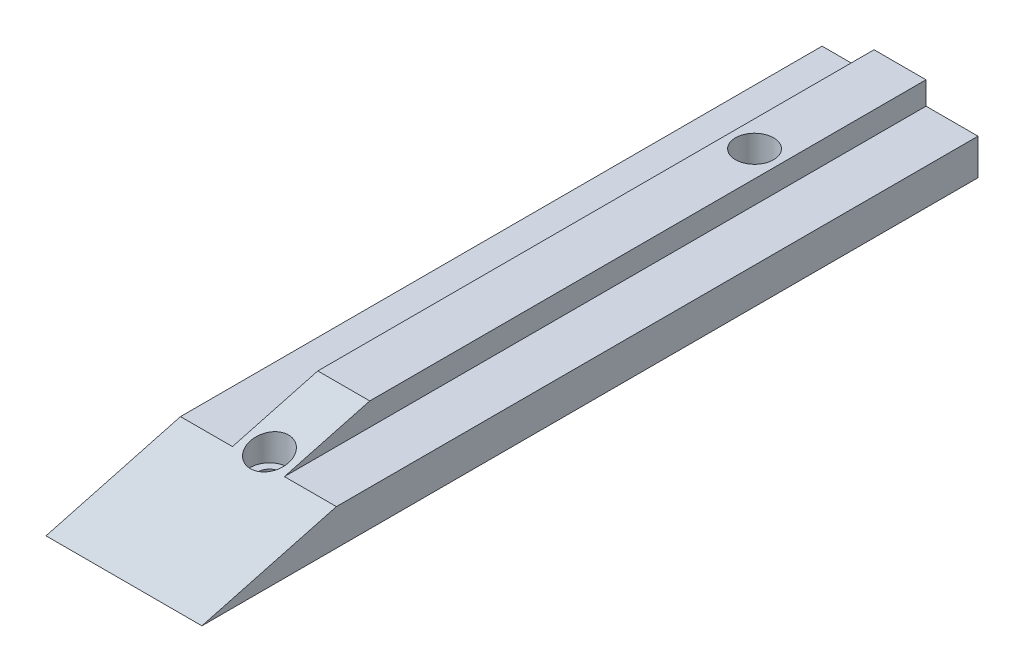
ISO-10303-21;
HEADER;
FILE_DESCRIPTION(('STEP AP214'),'2;1');
FILE_NAME('part.step','',(''),(''),'','','');
FILE_SCHEMA(('AUTOMOTIVE_DESIGN { 1 0 10303 214 1 1 1 1 }'));
ENDSEC;
DATA;
#1=APPLICATION_CONTEXT('core data for automotive mechanical design processes');
#2=APPLICATION_PROTOCOL_DEFINITION('international standard','automotive_design',2000,#1);
#3=PRODUCT_CONTEXT('',#1,'mechanical');
#4=PRODUCT('Part','Part','',(#3));
#5=PRODUCT_RELATED_PRODUCT_CATEGORY('part','',(#4));
#6=PRODUCT_DEFINITION_FORMATION('','',#4);
#7=PRODUCT_DEFINITION_CONTEXT('part definition',#1,'design');
#8=PRODUCT_DEFINITION('design','',#6,#7);
#9=PRODUCT_DEFINITION_SHAPE('','',#8);
#10=(LENGTH_UNIT() NAMED_UNIT(*) SI_UNIT(.MILLI.,.METRE.));
#11=(NAMED_UNIT(*) PLANE_ANGLE_UNIT() SI_UNIT($,.RADIAN.));
#12=(NAMED_UNIT(*) SI_UNIT($,.STERADIAN.) SOLID_ANGLE_UNIT());
#13=UNCERTAINTY_MEASURE_WITH_UNIT(LENGTH_MEASURE(1.E-05),#10,'distance_accuracy_value','');
#14=(GEOMETRIC_REPRESENTATION_CONTEXT(3) GLOBAL_UNCERTAINTY_ASSIGNED_CONTEXT((#13)) GLOBAL_UNIT_ASSIGNED_CONTEXT((#10,
#11,#12)) REPRESENTATION_CONTEXT('',''));
#15=CARTESIAN_POINT('',(0.,0.,0.));
#16=DIRECTION('',(0.,0.,1.));
#17=DIRECTION('',(1.,0.,0.));
#18=AXIS2_PLACEMENT_3D('',#15,#16,#17);
#19=CARTESIAN_POINT('',(22.5,10.4,112.));
#20=DIRECTION('',(0.,-1.,0.));
#21=DIRECTION('',(0.,0.,-1.));
#22=AXIS2_PLACEMENT_3D('',#19,#20,#21);
#23=PLANE('',#22);
#24=DIRECTION('',(0.,0.,-1.));
#25=VECTOR('',#24,1.);
#26=CARTESIAN_POINT('',(7.5,10.4,112.));
#27=LINE('',#26,#25);
#28=CARTESIAN_POINT('',(7.5,10.4,73.1866716012838));
#29=VERTEX_POINT('',#28);
#30=CARTESIAN_POINT('',(7.5,10.4,-112.));
#31=VERTEX_POINT('',#30);
#32=EDGE_CURVE('E11',#29,#31,#27,.T.);
#33=ORIENTED_EDGE('',*,*,#32,.F.);
#34=DIRECTION('',(1.,0.,0.));
#35=VECTOR('',#34,1.);
#36=CARTESIAN_POINT('',(22.5,10.4,73.1866716012838));
#37=LINE('',#36,#35);
#38=CARTESIAN_POINT('',(22.5,10.4,73.1866716012837));
#39=VERTEX_POINT('',#38);
#40=EDGE_CURVE('E180',#29,#39,#37,.T.);
#41=ORIENTED_EDGE('',*,*,#40,.T.);
#42=DIRECTION('',(0.,0.,-1.));
#43=VECTOR('',#42,1.);
#44=CARTESIAN_POINT('',(22.5,10.4,112.));
#45=LINE('',#44,#43);
#46=CARTESIAN_POINT('',(22.5,10.4,-112.));
#47=VERTEX_POINT('',#46);
#48=EDGE_CURVE('E115',#39,#47,#45,.T.);
#49=ORIENTED_EDGE('',*,*,#48,.T.);
#50=DIRECTION('',(-1.,0.,0.));
#51=VECTOR('',#50,1.);
#52=CARTESIAN_POINT('',(22.5,10.4,-112.));
#53=LINE('',#52,#51);
#54=EDGE_CURVE('E120',#47,#31,#53,.T.);
#55=ORIENTED_EDGE('',*,*,#54,.T.);
#56=EDGE_LOOP('',(#33,#41,#49,#55));
#57=FACE_BOUND('',#56,.T.);
#58=ADVANCED_FACE('F45',(#57),#23,.F.);
#59=CARTESIAN_POINT('',(7.5,10.4,112.));
#60=DIRECTION('',(-1.,0.,0.));
#61=DIRECTION('',(0.,0.,1.));
#62=AXIS2_PLACEMENT_3D('',#59,#60,#61);
#63=PLANE('',#62);
#64=DIRECTION('',(0.,0.,-1.));
#65=VECTOR('',#64,1.);
#66=CARTESIAN_POINT('',(7.5,17.,112.));
#67=LINE('',#66,#65);
#68=CARTESIAN_POINT('',(7.49999999999999,17.,48.5551362713293));
#69=VERTEX_POINT('',#68);
#70=CARTESIAN_POINT('',(7.5,17.,-112.));
#71=VERTEX_POINT('',#70);
#72=EDGE_CURVE('E55',#69,#71,#67,.T.);
#73=ORIENTED_EDGE('',*,*,#72,.F.);
#74=DIRECTION('',(0.,-0.258819045102522,0.965925826289068));
#75=VECTOR('',#74,1.);
#76=CARTESIAN_POINT('',(7.5,0.696667900320917,109.4));
#77=LINE('',#76,#75);
#78=EDGE_CURVE('E176',#69,#29,#77,.T.);
#79=ORIENTED_EDGE('',*,*,#78,.T.);
#80=ORIENTED_EDGE('',*,*,#32,.T.);
#81=DIRECTION('',(0.,1.,0.));
#82=VECTOR('',#81,1.);
#83=CARTESIAN_POINT('',(7.5,10.4,-112.));
#84=LINE('',#83,#82);
#85=EDGE_CURVE('E185',#31,#71,#84,.T.);
#86=ORIENTED_EDGE('',*,*,#85,.T.);
#87=EDGE_LOOP('',(#73,#79,#80,#86));
#88=FACE_BOUND('',#87,.T.);
#89=ADVANCED_FACE('F233',(#88),#63,.F.);
#90=CARTESIAN_POINT('',(-7.5,17.,112.));
#91=DIRECTION('',(0.,-1.,0.));
#92=DIRECTION('',(0.,0.,-1.));
#93=AXIS2_PLACEMENT_3D('',#90,#91,#92);
#94=PLANE('',#93);
#95=CARTESIAN_POINT('',(0.,17.,-70.));
#96=DIRECTION('',(0.,1.,0.));
#97=DIRECTION('',(0.,0.,1.));
#98=AXIS2_PLACEMENT_3D('',#95,#96,#97);
#99=CIRCLE('',#98,5.5);
#100=CARTESIAN_POINT('',(0.,17.,-64.5));
#101=VERTEX_POINT('',#100);
#102=EDGE_CURVE('E289',#101,#101,#99,.T.);
#103=ORIENTED_EDGE('',*,*,#102,.F.);
#104=EDGE_LOOP('',(#103));
#105=FACE_BOUND('',#104,.T.);
#106=DIRECTION('',(0.,0.,-1.));
#107=VECTOR('',#106,1.);
#108=CARTESIAN_POINT('',(-7.5,17.,112.));
#109=LINE('',#108,#107);
#110=CARTESIAN_POINT('',(-7.5,17.,48.5551362713293));
#111=VERTEX_POINT('',#110);
#112=CARTESIAN_POINT('',(-7.5,17.,-112.));
#113=VERTEX_POINT('',#112);
#114=EDGE_CURVE('E139',#111,#113,#109,.T.);
#115=ORIENTED_EDGE('',*,*,#114,.F.);
#116=DIRECTION('',(1.,0.,0.));
#117=VECTOR('',#116,1.);
#118=CARTESIAN_POINT('',(-22.5,17.,48.5551362713293));
#119=LINE('',#118,#117);
#120=EDGE_CURVE('E161',#111,#69,#119,.T.);
#121=ORIENTED_EDGE('',*,*,#120,.T.);
#122=ORIENTED_EDGE('',*,*,#72,.T.);
#123=DIRECTION('',(-1.,0.,0.));
#124=VECTOR('',#123,1.);
#125=CARTESIAN_POINT('',(-7.5,17.,-112.));
#126=LINE('',#125,#124);
#127=EDGE_CURVE('E189',#71,#113,#126,.T.);
#128=ORIENTED_EDGE('',*,*,#127,.T.);
#129=EDGE_LOOP('',(#115,#121,#122,#128));
#130=FACE_BOUND('',#129,.T.);
#131=ADVANCED_FACE('F219',(#105,#130),#94,.F.);
#132=CARTESIAN_POINT('',(-7.5,10.4,112.));
#133=DIRECTION('',(1.,0.,0.));
#134=DIRECTION('',(0.,0.,-1.));
#135=AXIS2_PLACEMENT_3D('',#132,#133,#134);
#136=PLANE('',#135);
#137=DIRECTION('',(0.,0.,-1.));
#138=VECTOR('',#137,1.);
#139=CARTESIAN_POINT('',(-7.5,10.4,112.));
#140=LINE('',#139,#138);
#141=CARTESIAN_POINT('',(-7.5,10.4,73.1866716012838));
#142=VERTEX_POINT('',#141);
#143=CARTESIAN_POINT('',(-7.5,10.4,-112.));
#144=VERTEX_POINT('',#143);
#145=EDGE_CURVE('E136',#142,#144,#140,.T.);
#146=ORIENTED_EDGE('',*,*,#145,.F.);
#147=DIRECTION('',(0.,0.258819045102522,-0.965925826289068));
#148=VECTOR('',#147,1.);
#149=CARTESIAN_POINT('',(-7.5,0.696667900320917,109.4));
#150=LINE('',#149,#148);
#151=EDGE_CURVE('E172',#142,#111,#150,.T.);
#152=ORIENTED_EDGE('',*,*,#151,.T.);
#153=ORIENTED_EDGE('',*,*,#114,.T.);
#154=DIRECTION('',(0.,-1.,0.));
#155=VECTOR('',#154,1.);
#156=CARTESIAN_POINT('',(-7.5,10.4,-112.));
#157=LINE('',#156,#155);
#158=EDGE_CURVE('E193',#113,#144,#157,.T.);
#159=ORIENTED_EDGE('',*,*,#158,.T.);
#160=EDGE_LOOP('',(#146,#152,#153,#159));
#161=FACE_BOUND('',#160,.T.);
#162=ADVANCED_FACE('F214',(#161),#136,.F.);
#163=CARTESIAN_POINT('',(-22.5,10.4,112.));
#164=DIRECTION('',(0.,-1.,0.));
#165=DIRECTION('',(0.,0.,-1.));
#166=AXIS2_PLACEMENT_3D('',#163,#164,#165);
#167=PLANE('',#166);
#168=DIRECTION('',(0.,0.,-1.));
#169=VECTOR('',#168,1.);
#170=CARTESIAN_POINT('',(-22.5,10.4,112.));
#171=LINE('',#170,#169);
#172=CARTESIAN_POINT('',(-22.5,10.4,73.1866716012837));
#173=VERTEX_POINT('',#172);
#174=CARTESIAN_POINT('',(-22.5,10.4,-112.));
#175=VERTEX_POINT('',#174);
#176=EDGE_CURVE('E133',#173,#175,#171,.T.);
#177=ORIENTED_EDGE('',*,*,#176,.F.);
#178=DIRECTION('',(1.,0.,0.));
#179=VECTOR('',#178,1.);
#180=CARTESIAN_POINT('',(-22.5,10.4,73.1866716012838));
#181=LINE('',#180,#179);
#182=EDGE_CURVE('E168',#173,#142,#181,.T.);
#183=ORIENTED_EDGE('',*,*,#182,.T.);
#184=ORIENTED_EDGE('',*,*,#145,.T.);
#185=DIRECTION('',(-1.,0.,0.));
#186=VECTOR('',#185,1.);
#187=CARTESIAN_POINT('',(-22.5,10.4,-112.));
#188=LINE('',#187,#186);
#189=EDGE_CURVE('E197',#144,#175,#188,.T.);
#190=ORIENTED_EDGE('',*,*,#189,.T.);
#191=EDGE_LOOP('',(#177,#183,#184,#190));
#192=FACE_BOUND('',#191,.T.);
#193=ADVANCED_FACE('F209',(#192),#167,.F.);
#194=CARTESIAN_POINT('',(-22.5,0.,112.));
#195=DIRECTION('',(1.,0.,0.));
#196=DIRECTION('',(0.,0.,-1.));
#197=AXIS2_PLACEMENT_3D('',#194,#195,#196);
#198=PLANE('',#197);
#199=DIRECTION('',(0.,0.,-1.));
#200=VECTOR('',#199,1.);
#201=CARTESIAN_POINT('',(-22.5,0.,112.));
#202=LINE('',#201,#200);
#203=CARTESIAN_POINT('',(-22.5,0.,112.));
#204=VERTEX_POINT('',#203);
#205=CARTESIAN_POINT('',(-22.5,0.,-112.));
#206=VERTEX_POINT('',#205);
#207=EDGE_CURVE('E98',#204,#206,#202,.T.);
#208=ORIENTED_EDGE('',*,*,#207,.F.);
#209=DIRECTION('',(0.,0.258819045102522,-0.965925826289068));
#210=VECTOR('',#209,1.);
#211=CARTESIAN_POINT('',(-22.5,0.,112.));
#212=LINE('',#211,#210);
#213=EDGE_CURVE('E63',#204,#173,#212,.T.);
#214=ORIENTED_EDGE('',*,*,#213,.T.);
#215=ORIENTED_EDGE('',*,*,#176,.T.);
#216=DIRECTION('',(0.,-1.,0.));
#217=VECTOR('',#216,1.);
#218=CARTESIAN_POINT('',(-22.5,0.,-112.));
#219=LINE('',#218,#217);
#220=EDGE_CURVE('E104',#175,#206,#219,.T.);
#221=ORIENTED_EDGE('',*,*,#220,.T.);
#222=EDGE_LOOP('',(#208,#214,#215,#221));
#223=FACE_BOUND('',#222,.T.);
#224=ADVANCED_FACE('F203',(#223),#198,.F.);
#225=CARTESIAN_POINT('',(22.5,0.,112.));
#226=DIRECTION('',(0.,1.,0.));
#227=DIRECTION('',(0.,0.,1.));
#228=AXIS2_PLACEMENT_3D('',#225,#226,#227);
#229=PLANE('',#228);
#230=CARTESIAN_POINT('',(0.,0.,-70.));
#231=DIRECTION('',(0.,1.,0.));
#232=DIRECTION('',(0.,0.,1.));
#233=AXIS2_PLACEMENT_3D('',#230,#231,#232);
#234=CIRCLE('',#233,3.3);
#235=CARTESIAN_POINT('',(0.,0.,-66.7));
#236=VERTEX_POINT('',#235);
#237=EDGE_CURVE('E48',#236,#236,#234,.T.);
#238=ORIENTED_EDGE('',*,*,#237,.T.);
#239=EDGE_LOOP('',(#238));
#240=FACE_BOUND('',#239,.T.);
#241=CARTESIAN_POINT('',(0.,0.,70.));
#242=DIRECTION('',(0.,1.,0.));
#243=DIRECTION('',(0.,0.,1.));
#244=AXIS2_PLACEMENT_3D('',#241,#242,#243);
#245=CIRCLE('',#244,3.3);
#246=CARTESIAN_POINT('',(0.,0.,73.3));
#247=VERTEX_POINT('',#246);
#248=EDGE_CURVE('E147',#247,#247,#245,.T.);
#249=ORIENTED_EDGE('',*,*,#248,.T.);
#250=EDGE_LOOP('',(#249));
#251=FACE_BOUND('',#250,.T.);
#252=DIRECTION('',(1.,0.,0.));
#253=VECTOR('',#252,1.);
#254=CARTESIAN_POINT('',(22.5,0.,-112.));
#255=LINE('',#254,#253);
#256=CARTESIAN_POINT('',(22.5,0.,-112.));
#257=VERTEX_POINT('',#256);
#258=EDGE_CURVE('E92',#206,#257,#255,.T.);
#259=ORIENTED_EDGE('',*,*,#258,.T.);
#260=DIRECTION('',(0.,0.,-1.));
#261=VECTOR('',#260,1.);
#262=CARTESIAN_POINT('',(22.5,0.,112.));
#263=LINE('',#262,#261);
#264=CARTESIAN_POINT('',(22.5,0.,112.));
#265=VERTEX_POINT('',#264);
#266=EDGE_CURVE('E97',#265,#257,#263,.T.);
#267=ORIENTED_EDGE('',*,*,#266,.F.);
#268=DIRECTION('',(1.,0.,0.));
#269=VECTOR('',#268,1.);
#270=CARTESIAN_POINT('',(22.5,0.,112.));
#271=LINE('',#270,#269);
#272=EDGE_CURVE('E122',#204,#265,#271,.T.);
#273=ORIENTED_EDGE('',*,*,#272,.F.);
#274=ORIENTED_EDGE('',*,*,#207,.T.);
#275=EDGE_LOOP('',(#259,#267,#273,#274));
#276=FACE_BOUND('',#275,.T.);
#277=ADVANCED_FACE('F94',(#240,#251,#276),#229,.F.);
#278=CARTESIAN_POINT('',(22.5,0.,112.));
#279=DIRECTION('',(-1.,0.,0.));
#280=DIRECTION('',(0.,0.,1.));
#281=AXIS2_PLACEMENT_3D('',#278,#279,#280);
#282=PLANE('',#281);
#283=ORIENTED_EDGE('',*,*,#48,.F.);
#284=DIRECTION('',(0.,0.258819045102522,-0.965925826289068));
#285=VECTOR('',#284,1.);
#286=CARTESIAN_POINT('',(22.5,0.,112.));
#287=LINE('',#286,#285);
#288=EDGE_CURVE('E113',#265,#39,#287,.T.);
#289=ORIENTED_EDGE('',*,*,#288,.F.);
#290=ORIENTED_EDGE('',*,*,#266,.T.);
#291=DIRECTION('',(0.,1.,0.));
#292=VECTOR('',#291,1.);
#293=CARTESIAN_POINT('',(22.5,0.,-112.));
#294=LINE('',#293,#292);
#295=EDGE_CURVE('E103',#257,#47,#294,.T.);
#296=ORIENTED_EDGE('',*,*,#295,.T.);
#297=EDGE_LOOP('',(#283,#289,#290,#296));
#298=FACE_BOUND('',#297,.T.);
#299=ADVANCED_FACE('F110',(#298),#282,.F.);
#300=CARTESIAN_POINT('',(0.,0.,-112.));
#301=DIRECTION('',(0.,0.,-1.));
#302=DIRECTION('',(-1.,0.,0.));
#303=AXIS2_PLACEMENT_3D('',#300,#301,#302);
#304=PLANE('',#303);
#305=ORIENTED_EDGE('',*,*,#54,.F.);
#306=ORIENTED_EDGE('',*,*,#295,.F.);
#307=ORIENTED_EDGE('',*,*,#258,.F.);
#308=ORIENTED_EDGE('',*,*,#220,.F.);
#309=ORIENTED_EDGE('',*,*,#189,.F.);
#310=ORIENTED_EDGE('',*,*,#158,.F.);
#311=ORIENTED_EDGE('',*,*,#127,.F.);
#312=ORIENTED_EDGE('',*,*,#85,.F.);
#313=EDGE_LOOP('',(#305,#306,#307,#308,#309,#310,#311,#312));
#314=FACE_BOUND('',#313,.T.);
#315=ADVANCED_FACE('F117',(#314),#304,.T.);
#316=CARTESIAN_POINT('',(-22.5,0.,112.));
#317=DIRECTION('',(0.,-0.965925826289068,-0.258819045102522));
#318=DIRECTION('',(0.,0.258819045102522,-0.965925826289068));
#319=AXIS2_PLACEMENT_3D('',#316,#317,#318);
#320=PLANE('',#319);
#321=CARTESIAN_POINT('',(0.,11.2538660821072,70.));
#322=DIRECTION('',(0.,-0.965925826289068,-0.258819045102522));
#323=DIRECTION('',(0.,0.258819045102522,-0.965925826289068));
#324=AXIS2_PLACEMENT_3D('',#321,#322,#323);
#325=ELLIPSE('',#324,5.69401899225546,5.5);
#326=CARTESIAN_POINT('',(0.,12.7275866404784,64.5));
#327=VERTEX_POINT('',#326);
#328=EDGE_CURVE('E144',#327,#327,#325,.T.);
#329=ORIENTED_EDGE('',*,*,#328,.T.);
#330=EDGE_LOOP('',(#329));
#331=FACE_BOUND('',#330,.T.);
#332=ORIENTED_EDGE('',*,*,#78,.F.);
#333=ORIENTED_EDGE('',*,*,#120,.F.);
#334=ORIENTED_EDGE('',*,*,#151,.F.);
#335=ORIENTED_EDGE('',*,*,#182,.F.);
#336=ORIENTED_EDGE('',*,*,#213,.F.);
#337=ORIENTED_EDGE('',*,*,#272,.T.);
#338=ORIENTED_EDGE('',*,*,#288,.T.);
#339=ORIENTED_EDGE('',*,*,#40,.F.);
#340=EDGE_LOOP('',(#332,#333,#334,#335,#336,#337,#338,#339));
#341=FACE_BOUND('',#340,.T.);
#342=ADVANCED_FACE('F232',(#331,#341),#320,.F.);
#343=CARTESIAN_POINT('',(0.,17.,70.));
#344=DIRECTION('',(0.,1.,0.));
#345=DIRECTION('',(0.,0.,1.));
#346=AXIS2_PLACEMENT_3D('',#343,#344,#345);
#347=CYLINDRICAL_SURFACE('',#346,3.3);
#348=CARTESIAN_POINT('',(0.,4.6,70.));
#349=DIRECTION('',(0.,1.,0.));
#350=DIRECTION('',(0.,0.,1.));
#351=AXIS2_PLACEMENT_3D('',#348,#349,#350);
#352=CIRCLE('',#351,3.3);
#353=CARTESIAN_POINT('',(0.,4.6,73.3));
#354=VERTEX_POINT('',#353);
#355=EDGE_CURVE('E148',#354,#354,#352,.T.);
#356=ORIENTED_EDGE('',*,*,#355,.T.);
#357=EDGE_LOOP('',(#356));
#358=FACE_BOUND('',#357,.T.);
#359=ORIENTED_EDGE('',*,*,#248,.F.);
#360=EDGE_LOOP('',(#359));
#361=FACE_BOUND('',#360,.T.);
#362=ADVANCED_FACE('F257',(#358,#361),#347,.F.);
#363=CARTESIAN_POINT('',(0.,17.,70.));
#364=DIRECTION('',(0.,1.,0.));
#365=DIRECTION('',(0.,0.,1.));
#366=AXIS2_PLACEMENT_3D('',#363,#364,#365);
#367=CYLINDRICAL_SURFACE('',#366,5.5);
#368=CARTESIAN_POINT('',(0.,4.6,70.));
#369=DIRECTION('',(0.,1.,0.));
#370=DIRECTION('',(0.,0.,1.));
#371=AXIS2_PLACEMENT_3D('',#368,#369,#370);
#372=CIRCLE('',#371,5.5);
#373=CARTESIAN_POINT('',(0.,4.6,75.5));
#374=VERTEX_POINT('',#373);
#375=EDGE_CURVE('E300',#374,#374,#372,.T.);
#376=ORIENTED_EDGE('',*,*,#375,.F.);
#377=EDGE_LOOP('',(#376));
#378=FACE_BOUND('',#377,.T.);
#379=ORIENTED_EDGE('',*,*,#328,.F.);
#380=EDGE_LOOP('',(#379));
#381=FACE_BOUND('',#380,.T.);
#382=ADVANCED_FACE('F261',(#378,#381),#367,.F.);
#383=CARTESIAN_POINT('',(3.30000000000002,4.6,70.));
#384=DIRECTION('',(0.,-1.,0.));
#385=DIRECTION('',(0.,0.,-1.));
#386=AXIS2_PLACEMENT_3D('',#383,#384,#385);
#387=PLANE('',#386);
#388=ORIENTED_EDGE('',*,*,#355,.F.);
#389=EDGE_LOOP('',(#388));
#390=FACE_BOUND('',#389,.T.);
#391=ORIENTED_EDGE('',*,*,#375,.T.);
#392=EDGE_LOOP('',(#391));
#393=FACE_BOUND('',#392,.T.);
#394=ADVANCED_FACE('F263',(#390,#393),#387,.F.);
#395=CARTESIAN_POINT('',(0.,17.,-70.));
#396=DIRECTION('',(0.,1.,0.));
#397=DIRECTION('',(0.,0.,1.));
#398=AXIS2_PLACEMENT_3D('',#395,#396,#397);
#399=CYLINDRICAL_SURFACE('',#398,3.3);
#400=CARTESIAN_POINT('',(0.,4.6,-70.));
#401=DIRECTION('',(0.,1.,0.));
#402=DIRECTION('',(0.,0.,1.));
#403=AXIS2_PLACEMENT_3D('',#400,#401,#402);
#404=CIRCLE('',#403,3.3);
#405=CARTESIAN_POINT('',(0.,4.6,-66.7));
#406=VERTEX_POINT('',#405);
#407=EDGE_CURVE('E294',#406,#406,#404,.T.);
#408=ORIENTED_EDGE('',*,*,#407,.T.);
#409=EDGE_LOOP('',(#408));
#410=FACE_BOUND('',#409,.T.);
#411=ORIENTED_EDGE('',*,*,#237,.F.);
#412=EDGE_LOOP('',(#411));
#413=FACE_BOUND('',#412,.T.);
#414=ADVANCED_FACE('F266',(#410,#413),#399,.F.);
#415=CARTESIAN_POINT('',(3.3,4.6,-70.));
#416=DIRECTION('',(0.,-1.,0.));
#417=DIRECTION('',(0.,0.,-1.));
#418=AXIS2_PLACEMENT_3D('',#415,#416,#417);
#419=PLANE('',#418);
#420=ORIENTED_EDGE('',*,*,#407,.F.);
#421=EDGE_LOOP('',(#420));
#422=FACE_BOUND('',#421,.T.);
#423=CARTESIAN_POINT('',(0.,4.6,-70.));
#424=DIRECTION('',(0.,1.,0.));
#425=DIRECTION('',(0.,0.,1.));
#426=AXIS2_PLACEMENT_3D('',#423,#424,#425);
#427=CIRCLE('',#426,5.5);
#428=CARTESIAN_POINT('',(0.,4.6,-64.5));
#429=VERTEX_POINT('',#428);
#430=EDGE_CURVE('E286',#429,#429,#427,.T.);
#431=ORIENTED_EDGE('',*,*,#430,.T.);
#432=EDGE_LOOP('',(#431));
#433=FACE_BOUND('',#432,.T.);
#434=ADVANCED_FACE('F273',(#422,#433),#419,.F.);
#435=CARTESIAN_POINT('',(0.,17.,-70.));
#436=DIRECTION('',(0.,1.,0.));
#437=DIRECTION('',(0.,0.,1.));
#438=AXIS2_PLACEMENT_3D('',#435,#436,#437);
#439=CYLINDRICAL_SURFACE('',#438,5.5);
#440=ORIENTED_EDGE('',*,*,#430,.F.);
#441=EDGE_LOOP('',(#440));
#442=FACE_BOUND('',#441,.T.);
#443=ORIENTED_EDGE('',*,*,#102,.T.);
#444=EDGE_LOOP('',(#443));
#445=FACE_BOUND('',#444,.T.);
#446=ADVANCED_FACE('F277',(#442,#445),#439,.F.);
#447=CLOSED_SHELL('',(#58,#89,#131,#162,#193,#224,#277,#299,#315,#342,#362,#382,#394,#414,#434,#446));
#448=MANIFOLD_SOLID_BREP('B2',#447);
#449=ADVANCED_BREP_SHAPE_REPRESENTATION('',(#18,#448),#14);
#450=SHAPE_DEFINITION_REPRESENTATION(#9,#449);
ENDSEC;
END-ISO-10303-21;
